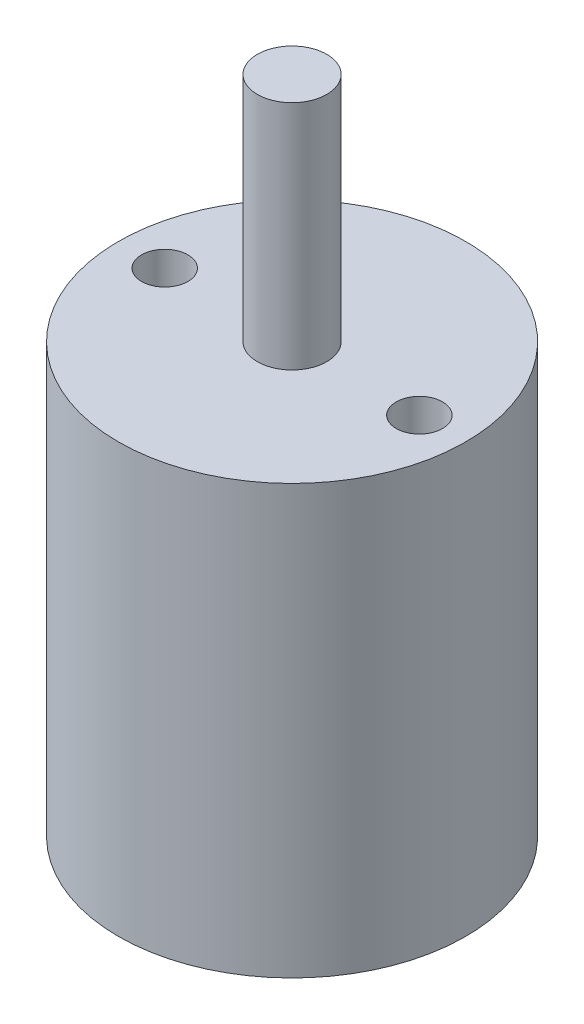
ISO-10303-21;
HEADER;
FILE_DESCRIPTION(('STEP AP214'),'2;1');
FILE_NAME('part.step','',(''),(''),'','','');
FILE_SCHEMA(('AUTOMOTIVE_DESIGN { 1 0 10303 214 1 1 1 1 }'));
ENDSEC;
DATA;
#1=APPLICATION_CONTEXT('core data for automotive mechanical design processes');
#2=APPLICATION_PROTOCOL_DEFINITION('international standard','automotive_design',2000,#1);
#3=PRODUCT_CONTEXT('',#1,'mechanical');
#4=PRODUCT('Part','Part','',(#3));
#5=PRODUCT_RELATED_PRODUCT_CATEGORY('part','',(#4));
#6=PRODUCT_DEFINITION_FORMATION('','',#4);
#7=PRODUCT_DEFINITION_CONTEXT('part definition',#1,'design');
#8=PRODUCT_DEFINITION('design','',#6,#7);
#9=PRODUCT_DEFINITION_SHAPE('','',#8);
#10=(LENGTH_UNIT() NAMED_UNIT(*) SI_UNIT(.MILLI.,.METRE.));
#11=(NAMED_UNIT(*) PLANE_ANGLE_UNIT() SI_UNIT($,.RADIAN.));
#12=(NAMED_UNIT(*) SI_UNIT($,.STERADIAN.) SOLID_ANGLE_UNIT());
#13=UNCERTAINTY_MEASURE_WITH_UNIT(LENGTH_MEASURE(1.E-05),#10,'distance_accuracy_value','');
#14=(GEOMETRIC_REPRESENTATION_CONTEXT(3) GLOBAL_UNCERTAINTY_ASSIGNED_CONTEXT((#13)) GLOBAL_UNIT_ASSIGNED_CONTEXT((#10,
#11,#12)) REPRESENTATION_CONTEXT('',''));
#15=CARTESIAN_POINT('',(0.,0.,0.));
#16=DIRECTION('',(0.,0.,1.));
#17=DIRECTION('',(1.,0.,0.));
#18=AXIS2_PLACEMENT_3D('',#15,#16,#17);
#19=CARTESIAN_POINT('',(0.,18.5,0.));
#20=DIRECTION('',(0.,-1.,0.));
#21=DIRECTION('',(0.,0.,-1.));
#22=AXIS2_PLACEMENT_3D('',#19,#20,#21);
#23=CYLINDRICAL_SURFACE('',#22,7.5);
#24=CARTESIAN_POINT('',(0.,18.5,0.));
#25=DIRECTION('',(0.,1.,0.));
#26=DIRECTION('',(0.,0.,1.));
#27=AXIS2_PLACEMENT_3D('',#24,#25,#26);
#28=CIRCLE('',#27,7.5);
#29=CARTESIAN_POINT('',(0.,18.5,7.5));
#30=VERTEX_POINT('',#29);
#31=EDGE_CURVE('E41',#30,#30,#28,.T.);
#32=ORIENTED_EDGE('',*,*,#31,.F.);
#33=EDGE_LOOP('',(#32));
#34=FACE_BOUND('',#33,.T.);
#35=CARTESIAN_POINT('',(0.,0.,0.));
#36=DIRECTION('',(0.,1.,0.));
#37=DIRECTION('',(0.,0.,1.));
#38=AXIS2_PLACEMENT_3D('',#35,#36,#37);
#39=CIRCLE('',#38,7.5);
#40=CARTESIAN_POINT('',(0.,0.,7.5));
#41=VERTEX_POINT('',#40);
#42=EDGE_CURVE('E37',#41,#41,#39,.T.);
#43=ORIENTED_EDGE('',*,*,#42,.T.);
#44=EDGE_LOOP('',(#43));
#45=FACE_BOUND('',#44,.T.);
#46=ADVANCED_FACE('F34',(#34,#45),#23,.T.);
#47=CARTESIAN_POINT('',(0.,18.5,0.));
#48=DIRECTION('',(0.,1.,0.));
#49=DIRECTION('',(0.,0.,1.));
#50=AXIS2_PLACEMENT_3D('',#47,#48,#49);
#51=PLANE('',#50);
#52=CARTESIAN_POINT('',(-5.5,18.5,0.));
#53=DIRECTION('',(0.,1.,0.));
#54=DIRECTION('',(0.,0.,1.));
#55=AXIS2_PLACEMENT_3D('',#52,#53,#54);
#56=CIRCLE('',#55,1.);
#57=CARTESIAN_POINT('',(-5.5,18.5,1.));
#58=VERTEX_POINT('',#57);
#59=EDGE_CURVE('E57',#58,#58,#56,.T.);
#60=ORIENTED_EDGE('',*,*,#59,.F.);
#61=EDGE_LOOP('',(#60));
#62=FACE_BOUND('',#61,.T.);
#63=CARTESIAN_POINT('',(5.5,18.5,0.));
#64=DIRECTION('',(0.,1.,0.));
#65=DIRECTION('',(0.,0.,1.));
#66=AXIS2_PLACEMENT_3D('',#63,#64,#65);
#67=CIRCLE('',#66,1.);
#68=CARTESIAN_POINT('',(5.5,18.5,0.999999999999998));
#69=VERTEX_POINT('',#68);
#70=EDGE_CURVE('E51',#69,#69,#67,.T.);
#71=ORIENTED_EDGE('',*,*,#70,.F.);
#72=EDGE_LOOP('',(#71));
#73=FACE_BOUND('',#72,.T.);
#74=CARTESIAN_POINT('',(0.,18.5,0.));
#75=DIRECTION('',(0.,1.,0.));
#76=DIRECTION('',(0.,0.,1.));
#77=AXIS2_PLACEMENT_3D('',#74,#75,#76);
#78=CIRCLE('',#77,1.5);
#79=CARTESIAN_POINT('',(0.,18.5,1.5));
#80=VERTEX_POINT('',#79);
#81=EDGE_CURVE('E10',#80,#80,#78,.T.);
#82=ORIENTED_EDGE('',*,*,#81,.F.);
#83=EDGE_LOOP('',(#82));
#84=FACE_BOUND('',#83,.T.);
#85=ORIENTED_EDGE('',*,*,#31,.T.);
#86=EDGE_LOOP('',(#85));
#87=FACE_BOUND('',#86,.T.);
#88=ADVANCED_FACE('F72',(#62,#73,#84,#87),#51,.T.);
#89=CARTESIAN_POINT('',(0.,0.,0.));
#90=DIRECTION('',(0.,1.,0.));
#91=DIRECTION('',(0.,0.,1.));
#92=AXIS2_PLACEMENT_3D('',#89,#90,#91);
#93=PLANE('',#92);
#94=ORIENTED_EDGE('',*,*,#42,.F.);
#95=EDGE_LOOP('',(#94));
#96=FACE_BOUND('',#95,.T.);
#97=ADVANCED_FACE('F75',(#96),#93,.F.);
#98=CARTESIAN_POINT('',(0.,28.5,0.));
#99=DIRECTION('',(0.,-1.,0.));
#100=DIRECTION('',(0.,0.,-1.));
#101=AXIS2_PLACEMENT_3D('',#98,#99,#100);
#102=CYLINDRICAL_SURFACE('',#101,1.5);
#103=CARTESIAN_POINT('',(0.,28.5,0.));
#104=DIRECTION('',(0.,1.,0.));
#105=DIRECTION('',(0.,0.,1.));
#106=AXIS2_PLACEMENT_3D('',#103,#104,#105);
#107=CIRCLE('',#106,1.5);
#108=CARTESIAN_POINT('',(0.,28.5,1.5));
#109=VERTEX_POINT('',#108);
#110=EDGE_CURVE('E47',#109,#109,#107,.T.);
#111=ORIENTED_EDGE('',*,*,#110,.F.);
#112=EDGE_LOOP('',(#111));
#113=FACE_BOUND('',#112,.T.);
#114=ORIENTED_EDGE('',*,*,#81,.T.);
#115=EDGE_LOOP('',(#114));
#116=FACE_BOUND('',#115,.T.);
#117=ADVANCED_FACE('F88',(#113,#116),#102,.T.);
#118=CARTESIAN_POINT('',(0.,28.5,0.));
#119=DIRECTION('',(0.,1.,0.));
#120=DIRECTION('',(0.,0.,1.));
#121=AXIS2_PLACEMENT_3D('',#118,#119,#120);
#122=PLANE('',#121);
#123=ORIENTED_EDGE('',*,*,#110,.T.);
#124=EDGE_LOOP('',(#123));
#125=FACE_BOUND('',#124,.T.);
#126=ADVANCED_FACE('F93',(#125),#122,.T.);
#127=CARTESIAN_POINT('',(5.5,8.5,0.));
#128=DIRECTION('',(0.,1.,0.));
#129=DIRECTION('',(0.,0.,1.));
#130=AXIS2_PLACEMENT_3D('',#127,#128,#129);
#131=CYLINDRICAL_SURFACE('',#130,1.);
#132=CARTESIAN_POINT('',(5.5,8.5,0.));
#133=DIRECTION('',(0.,1.,0.));
#134=DIRECTION('',(0.,0.,1.));
#135=AXIS2_PLACEMENT_3D('',#132,#133,#134);
#136=CIRCLE('',#135,1.);
#137=CARTESIAN_POINT('',(5.5,8.5,0.999999999999998));
#138=VERTEX_POINT('',#137);
#139=EDGE_CURVE('E54',#138,#138,#136,.T.);
#140=ORIENTED_EDGE('',*,*,#139,.F.);
#141=EDGE_LOOP('',(#140));
#142=FACE_BOUND('',#141,.T.);
#143=ORIENTED_EDGE('',*,*,#70,.T.);
#144=EDGE_LOOP('',(#143));
#145=FACE_BOUND('',#144,.T.);
#146=ADVANCED_FACE('F99',(#142,#145),#131,.F.);
#147=CARTESIAN_POINT('',(5.5,8.5,0.));
#148=DIRECTION('',(0.,1.,0.));
#149=DIRECTION('',(0.,0.,1.));
#150=AXIS2_PLACEMENT_3D('',#147,#148,#149);
#151=PLANE('',#150);
#152=ORIENTED_EDGE('',*,*,#139,.T.);
#153=EDGE_LOOP('',(#152));
#154=FACE_BOUND('',#153,.T.);
#155=ADVANCED_FACE('F68',(#154),#151,.T.);
#156=CARTESIAN_POINT('',(-5.5,8.5,0.));
#157=DIRECTION('',(0.,1.,0.));
#158=DIRECTION('',(0.,0.,1.));
#159=AXIS2_PLACEMENT_3D('',#156,#157,#158);
#160=CYLINDRICAL_SURFACE('',#159,1.);
#161=CARTESIAN_POINT('',(-5.5,8.5,0.));
#162=DIRECTION('',(0.,1.,0.));
#163=DIRECTION('',(0.,0.,1.));
#164=AXIS2_PLACEMENT_3D('',#161,#162,#163);
#165=CIRCLE('',#164,1.);
#166=CARTESIAN_POINT('',(-5.5,8.5,1.));
#167=VERTEX_POINT('',#166);
#168=EDGE_CURVE('E50',#167,#167,#165,.T.);
#169=ORIENTED_EDGE('',*,*,#168,.F.);
#170=EDGE_LOOP('',(#169));
#171=FACE_BOUND('',#170,.T.);
#172=ORIENTED_EDGE('',*,*,#59,.T.);
#173=EDGE_LOOP('',(#172));
#174=FACE_BOUND('',#173,.T.);
#175=ADVANCED_FACE('F65',(#171,#174),#160,.F.);
#176=CARTESIAN_POINT('',(-5.5,8.5,0.));
#177=DIRECTION('',(0.,1.,0.));
#178=DIRECTION('',(0.,0.,1.));
#179=AXIS2_PLACEMENT_3D('',#176,#177,#178);
#180=PLANE('',#179);
#181=ORIENTED_EDGE('',*,*,#168,.T.);
#182=EDGE_LOOP('',(#181));
#183=FACE_BOUND('',#182,.T.);
#184=ADVANCED_FACE('F63',(#183),#180,.T.);
#185=CLOSED_SHELL('',(#46,#88,#97,#117,#126,#146,#155,#175,#184));
#186=MANIFOLD_SOLID_BREP('B2',#185);
#187=ADVANCED_BREP_SHAPE_REPRESENTATION('',(#18,#186),#14);
#188=SHAPE_DEFINITION_REPRESENTATION(#9,#187);
ENDSEC;
END-ISO-10303-21;
